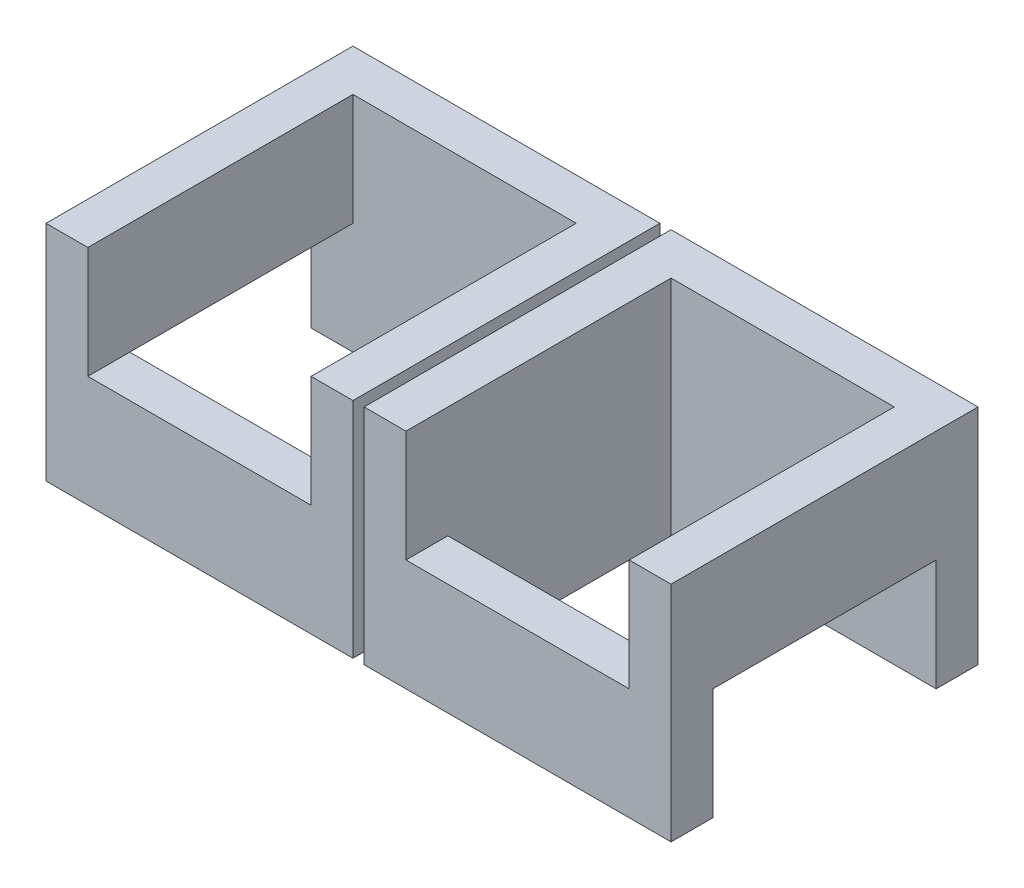
ISO-10303-21;
HEADER;
FILE_DESCRIPTION(('STEP AP214'),'2;1');
FILE_NAME('part.step','',(''),(''),'','','');
FILE_SCHEMA(('AUTOMOTIVE_DESIGN { 1 0 10303 214 1 1 1 1 }'));
ENDSEC;
DATA;
#1=APPLICATION_CONTEXT('core data for automotive mechanical design processes');
#2=APPLICATION_PROTOCOL_DEFINITION('international standard','automotive_design',2000,#1);
#3=PRODUCT_CONTEXT('',#1,'mechanical');
#4=PRODUCT('Part','Part','',(#3));
#5=PRODUCT_RELATED_PRODUCT_CATEGORY('part','',(#4));
#6=PRODUCT_DEFINITION_FORMATION('','',#4);
#7=PRODUCT_DEFINITION_CONTEXT('part definition',#1,'design');
#8=PRODUCT_DEFINITION('design','',#6,#7);
#9=PRODUCT_DEFINITION_SHAPE('','',#8);
#10=(LENGTH_UNIT() NAMED_UNIT(*) SI_UNIT(.MILLI.,.METRE.));
#11=(NAMED_UNIT(*) PLANE_ANGLE_UNIT() SI_UNIT($,.RADIAN.));
#12=(NAMED_UNIT(*) SI_UNIT($,.STERADIAN.) SOLID_ANGLE_UNIT());
#13=UNCERTAINTY_MEASURE_WITH_UNIT(LENGTH_MEASURE(1.E-05),#10,'distance_accuracy_value','');
#14=(GEOMETRIC_REPRESENTATION_CONTEXT(3) GLOBAL_UNCERTAINTY_ASSIGNED_CONTEXT((#13)) GLOBAL_UNIT_ASSIGNED_CONTEXT((#10,
#11,#12)) REPRESENTATION_CONTEXT('',''));
#15=CARTESIAN_POINT('',(0.,0.,0.));
#16=DIRECTION('',(0.,0.,1.));
#17=DIRECTION('',(1.,0.,0.));
#18=AXIS2_PLACEMENT_3D('',#15,#16,#17);
#19=CARTESIAN_POINT('',(195.58,101.6,50.8));
#20=DIRECTION('',(0.,0.,-1.));
#21=DIRECTION('',(1.,0.,0.));
#22=AXIS2_PLACEMENT_3D('',#19,#20,#21);
#23=PLANE('',#22);
#24=DIRECTION('',(-1.,0.,0.));
#25=VECTOR('',#24,1.);
#26=CARTESIAN_POINT('',(195.58,0.,50.8));
#27=LINE('',#26,#25);
#28=CARTESIAN_POINT('',(214.63,0.,50.8));
#29=VERTEX_POINT('',#28);
#30=CARTESIAN_POINT('',(93.98,0.,50.8));
#31=VERTEX_POINT('',#30);
#32=EDGE_CURVE('E222',#29,#31,#27,.T.);
#33=ORIENTED_EDGE('',*,*,#32,.T.);
#34=DIRECTION('',(0.,-1.,0.));
#35=VECTOR('',#34,1.);
#36=CARTESIAN_POINT('',(93.98,101.6,50.8));
#37=LINE('',#36,#35);
#38=CARTESIAN_POINT('',(93.98,50.8,50.8));
#39=VERTEX_POINT('',#38);
#40=EDGE_CURVE('E230',#39,#31,#37,.T.);
#41=ORIENTED_EDGE('',*,*,#40,.F.);
#42=DIRECTION('',(-1.,0.,0.));
#43=VECTOR('',#42,1.);
#44=CARTESIAN_POINT('',(195.58,50.8,50.8));
#45=LINE('',#44,#43);
#46=CARTESIAN_POINT('',(195.58,50.8,50.8));
#47=VERTEX_POINT('',#46);
#48=EDGE_CURVE('E188',#47,#39,#45,.T.);
#49=ORIENTED_EDGE('',*,*,#48,.F.);
#50=DIRECTION('',(1.,0.,0.));
#51=VECTOR('',#50,1.);
#52=CARTESIAN_POINT('',(195.58,50.8,50.8));
#53=LINE('',#52,#51);
#54=CARTESIAN_POINT('',(214.63,50.8,50.8));
#55=VERTEX_POINT('',#54);
#56=EDGE_CURVE('E169',#47,#55,#53,.T.);
#57=ORIENTED_EDGE('',*,*,#56,.T.);
#58=DIRECTION('',(0.,-1.,0.));
#59=VECTOR('',#58,1.);
#60=CARTESIAN_POINT('',(214.63,154.170510785233,50.8));
#61=LINE('',#60,#59);
#62=EDGE_CURVE('E177',#55,#29,#61,.T.);
#63=ORIENTED_EDGE('',*,*,#62,.T.);
#64=EDGE_LOOP('',(#33,#41,#49,#57,#63));
#65=FACE_BOUND('',#64,.T.);
#66=ADVANCED_FACE('F77',(#65),#23,.T.);
#67=CARTESIAN_POINT('',(144.78,101.6,0.));
#68=DIRECTION('',(0.,1.,0.));
#69=DIRECTION('',(0.,0.,1.));
#70=AXIS2_PLACEMENT_3D('',#67,#68,#69);
#71=PLANE('',#70);
#72=DIRECTION('',(-1.,0.,0.));
#73=VECTOR('',#72,1.);
#74=CARTESIAN_POINT('',(144.78,101.6,69.85));
#75=LINE('',#74,#73);
#76=CARTESIAN_POINT('',(214.63,101.6,69.85));
#77=VERTEX_POINT('',#76);
#78=CARTESIAN_POINT('',(195.58,101.6,69.85));
#79=VERTEX_POINT('',#78);
#80=EDGE_CURVE('E263',#77,#79,#75,.T.);
#81=ORIENTED_EDGE('',*,*,#80,.F.);
#82=DIRECTION('',(0.,0.,1.));
#83=VECTOR('',#82,1.);
#84=CARTESIAN_POINT('',(214.63,101.6,0.));
#85=LINE('',#84,#83);
#86=CARTESIAN_POINT('',(214.63,101.6,-69.85));
#87=VERTEX_POINT('',#86);
#88=EDGE_CURVE('E258',#87,#77,#85,.T.);
#89=ORIENTED_EDGE('',*,*,#88,.F.);
#90=DIRECTION('',(1.,0.,0.));
#91=VECTOR('',#90,1.);
#92=CARTESIAN_POINT('',(144.78,101.6,-69.85));
#93=LINE('',#92,#91);
#94=CARTESIAN_POINT('',(74.93,101.6,-69.85));
#95=VERTEX_POINT('',#94);
#96=EDGE_CURVE('E253',#95,#87,#93,.T.);
#97=ORIENTED_EDGE('',*,*,#96,.F.);
#98=DIRECTION('',(0.,0.,-1.));
#99=VECTOR('',#98,1.);
#100=CARTESIAN_POINT('',(74.93,101.6,0.));
#101=LINE('',#100,#99);
#102=CARTESIAN_POINT('',(74.93,101.6,69.85));
#103=VERTEX_POINT('',#102);
#104=EDGE_CURVE('E249',#103,#95,#101,.T.);
#105=ORIENTED_EDGE('',*,*,#104,.F.);
#106=CARTESIAN_POINT('',(93.98,101.6,69.85));
#107=VERTEX_POINT('',#106);
#108=EDGE_CURVE('E262',#107,#103,#75,.T.);
#109=ORIENTED_EDGE('',*,*,#108,.F.);
#110=DIRECTION('',(0.,0.,-1.));
#111=VECTOR('',#110,1.);
#112=CARTESIAN_POINT('',(93.98,101.6,50.8));
#113=LINE('',#112,#111);
#114=CARTESIAN_POINT('',(93.98,101.6,-50.8));
#115=VERTEX_POINT('',#114);
#116=EDGE_CURVE('E217',#107,#115,#113,.T.);
#117=ORIENTED_EDGE('',*,*,#116,.T.);
#118=DIRECTION('',(1.,0.,0.));
#119=VECTOR('',#118,1.);
#120=CARTESIAN_POINT('',(195.58,101.6,-50.8));
#121=LINE('',#120,#119);
#122=CARTESIAN_POINT('',(195.58,101.6,-50.8));
#123=VERTEX_POINT('',#122);
#124=EDGE_CURVE('E221',#115,#123,#121,.T.);
#125=ORIENTED_EDGE('',*,*,#124,.T.);
#126=DIRECTION('',(0.,0.,1.));
#127=VECTOR('',#126,1.);
#128=CARTESIAN_POINT('',(195.58,101.6,50.8));
#129=LINE('',#128,#127);
#130=EDGE_CURVE('E226',#123,#79,#129,.T.);
#131=ORIENTED_EDGE('',*,*,#130,.T.);
#132=EDGE_LOOP('',(#81,#89,#97,#105,#109,#117,#125,#131));
#133=FACE_BOUND('',#132,.T.);
#134=ADVANCED_FACE('F302',(#133),#71,.T.);
#135=CARTESIAN_POINT('',(144.78,0.,0.));
#136=DIRECTION('',(0.,1.,0.));
#137=DIRECTION('',(0.,0.,1.));
#138=AXIS2_PLACEMENT_3D('',#135,#136,#137);
#139=PLANE('',#138);
#140=DIRECTION('',(0.,0.,1.));
#141=VECTOR('',#140,1.);
#142=CARTESIAN_POINT('',(214.63,0.,0.));
#143=LINE('',#142,#141);
#144=CARTESIAN_POINT('',(214.63,0.,69.85));
#145=VERTEX_POINT('',#144);
#146=EDGE_CURVE('E182',#29,#145,#143,.T.);
#147=ORIENTED_EDGE('',*,*,#146,.T.);
#148=DIRECTION('',(-1.,0.,0.));
#149=VECTOR('',#148,1.);
#150=CARTESIAN_POINT('',(144.78,0.,69.85));
#151=LINE('',#150,#149);
#152=CARTESIAN_POINT('',(74.93,0.,69.85));
#153=VERTEX_POINT('',#152);
#154=EDGE_CURVE('E254',#145,#153,#151,.T.);
#155=ORIENTED_EDGE('',*,*,#154,.T.);
#156=DIRECTION('',(0.,0.,-1.));
#157=VECTOR('',#156,1.);
#158=CARTESIAN_POINT('',(74.93,0.,0.));
#159=LINE('',#158,#157);
#160=CARTESIAN_POINT('',(74.93,0.,-69.85));
#161=VERTEX_POINT('',#160);
#162=EDGE_CURVE('E248',#153,#161,#159,.T.);
#163=ORIENTED_EDGE('',*,*,#162,.T.);
#164=DIRECTION('',(1.,0.,0.));
#165=VECTOR('',#164,1.);
#166=CARTESIAN_POINT('',(144.78,0.,-69.85));
#167=LINE('',#166,#165);
#168=CARTESIAN_POINT('',(214.63,0.,-69.85));
#169=VERTEX_POINT('',#168);
#170=EDGE_CURVE('E271',#161,#169,#167,.T.);
#171=ORIENTED_EDGE('',*,*,#170,.T.);
#172=CARTESIAN_POINT('',(214.63,0.,-50.8));
#173=VERTEX_POINT('',#172);
#174=EDGE_CURVE('E275',#169,#173,#143,.T.);
#175=ORIENTED_EDGE('',*,*,#174,.T.);
#176=DIRECTION('',(1.,0.,0.));
#177=VECTOR('',#176,1.);
#178=CARTESIAN_POINT('',(195.58,0.,-50.8));
#179=LINE('',#178,#177);
#180=CARTESIAN_POINT('',(93.98,0.,-50.8));
#181=VERTEX_POINT('',#180);
#182=EDGE_CURVE('E233',#181,#173,#179,.T.);
#183=ORIENTED_EDGE('',*,*,#182,.F.);
#184=DIRECTION('',(0.,0.,-1.));
#185=VECTOR('',#184,1.);
#186=CARTESIAN_POINT('',(93.98,0.,50.8));
#187=LINE('',#186,#185);
#188=EDGE_CURVE('E101',#31,#181,#187,.T.);
#189=ORIENTED_EDGE('',*,*,#188,.F.);
#190=ORIENTED_EDGE('',*,*,#32,.F.);
#191=EDGE_LOOP('',(#147,#155,#163,#171,#175,#183,#189,#190));
#192=FACE_BOUND('',#191,.T.);
#193=ADVANCED_FACE('F293',(#192),#139,.F.);
#194=CARTESIAN_POINT('',(74.93,101.6,0.));
#195=DIRECTION('',(1.,0.,0.));
#196=DIRECTION('',(0.,0.,1.));
#197=AXIS2_PLACEMENT_3D('',#194,#195,#196);
#198=PLANE('',#197);
#199=ORIENTED_EDGE('',*,*,#162,.F.);
#200=DIRECTION('',(0.,-1.,0.));
#201=VECTOR('',#200,1.);
#202=CARTESIAN_POINT('',(74.93,101.6,69.85));
#203=LINE('',#202,#201);
#204=EDGE_CURVE('E267',#103,#153,#203,.T.);
#205=ORIENTED_EDGE('',*,*,#204,.F.);
#206=ORIENTED_EDGE('',*,*,#104,.T.);
#207=DIRECTION('',(0.,-1.,0.));
#208=VECTOR('',#207,1.);
#209=CARTESIAN_POINT('',(74.93,101.6,-69.85));
#210=LINE('',#209,#208);
#211=EDGE_CURVE('E13',#95,#161,#210,.T.);
#212=ORIENTED_EDGE('',*,*,#211,.T.);
#213=EDGE_LOOP('',(#199,#205,#206,#212));
#214=FACE_BOUND('',#213,.T.);
#215=ADVANCED_FACE('F79',(#214),#198,.F.);
#216=CARTESIAN_POINT('',(144.78,101.6,-69.85));
#217=DIRECTION('',(0.,0.,1.));
#218=DIRECTION('',(-1.,0.,0.));
#219=AXIS2_PLACEMENT_3D('',#216,#217,#218);
#220=PLANE('',#219);
#221=ORIENTED_EDGE('',*,*,#170,.F.);
#222=ORIENTED_EDGE('',*,*,#211,.F.);
#223=ORIENTED_EDGE('',*,*,#96,.T.);
#224=DIRECTION('',(0.,-1.,0.));
#225=VECTOR('',#224,1.);
#226=CARTESIAN_POINT('',(214.63,101.6,-69.85));
#227=LINE('',#226,#225);
#228=EDGE_CURVE('E86',#87,#169,#227,.T.);
#229=ORIENTED_EDGE('',*,*,#228,.T.);
#230=EDGE_LOOP('',(#221,#222,#223,#229));
#231=FACE_BOUND('',#230,.T.);
#232=ADVANCED_FACE('F290',(#231),#220,.F.);
#233=CARTESIAN_POINT('',(214.63,101.6,0.));
#234=DIRECTION('',(-1.,0.,0.));
#235=DIRECTION('',(0.,0.,-1.));
#236=AXIS2_PLACEMENT_3D('',#233,#234,#235);
#237=PLANE('',#236);
#238=DIRECTION('',(0.,0.,-1.));
#239=VECTOR('',#238,1.);
#240=CARTESIAN_POINT('',(214.63,50.8,50.8));
#241=LINE('',#240,#239);
#242=CARTESIAN_POINT('',(214.63,50.8,-50.8));
#243=VERTEX_POINT('',#242);
#244=EDGE_CURVE('E165',#55,#243,#241,.T.);
#245=ORIENTED_EDGE('',*,*,#244,.T.);
#246=DIRECTION('',(0.,-1.,0.));
#247=VECTOR('',#246,1.);
#248=CARTESIAN_POINT('',(214.63,154.170510785233,-50.8));
#249=LINE('',#248,#247);
#250=EDGE_CURVE('E176',#243,#173,#249,.T.);
#251=ORIENTED_EDGE('',*,*,#250,.T.);
#252=ORIENTED_EDGE('',*,*,#174,.F.);
#253=ORIENTED_EDGE('',*,*,#228,.F.);
#254=ORIENTED_EDGE('',*,*,#88,.T.);
#255=DIRECTION('',(0.,-1.,0.));
#256=VECTOR('',#255,1.);
#257=CARTESIAN_POINT('',(214.63,101.6,69.85));
#258=LINE('',#257,#256);
#259=EDGE_CURVE('E284',#77,#145,#258,.T.);
#260=ORIENTED_EDGE('',*,*,#259,.T.);
#261=ORIENTED_EDGE('',*,*,#146,.F.);
#262=ORIENTED_EDGE('',*,*,#62,.F.);
#263=EDGE_LOOP('',(#245,#251,#252,#253,#254,#260,#261,#262));
#264=FACE_BOUND('',#263,.T.);
#265=ADVANCED_FACE('F180',(#264),#237,.F.);
#266=CARTESIAN_POINT('',(144.78,101.6,69.85));
#267=DIRECTION('',(0.,0.,-1.));
#268=DIRECTION('',(1.,0.,0.));
#269=AXIS2_PLACEMENT_3D('',#266,#267,#268);
#270=PLANE('',#269);
#271=DIRECTION('',(1.,0.,0.));
#272=VECTOR('',#271,1.);
#273=CARTESIAN_POINT('',(195.58,50.8,69.85));
#274=LINE('',#273,#272);
#275=CARTESIAN_POINT('',(93.98,50.8,69.85));
#276=VERTEX_POINT('',#275);
#277=CARTESIAN_POINT('',(195.58,50.8,69.85));
#278=VERTEX_POINT('',#277);
#279=EDGE_CURVE('E209',#276,#278,#274,.T.);
#280=ORIENTED_EDGE('',*,*,#279,.F.);
#281=DIRECTION('',(0.,1.,0.));
#282=VECTOR('',#281,1.);
#283=CARTESIAN_POINT('',(93.98,-52.5705107852331,69.85));
#284=LINE('',#283,#282);
#285=EDGE_CURVE('E203',#276,#107,#284,.T.);
#286=ORIENTED_EDGE('',*,*,#285,.T.);
#287=ORIENTED_EDGE('',*,*,#108,.T.);
#288=ORIENTED_EDGE('',*,*,#204,.T.);
#289=ORIENTED_EDGE('',*,*,#154,.F.);
#290=ORIENTED_EDGE('',*,*,#259,.F.);
#291=ORIENTED_EDGE('',*,*,#80,.T.);
#292=DIRECTION('',(0.,1.,0.));
#293=VECTOR('',#292,1.);
#294=CARTESIAN_POINT('',(195.58,-52.5705107852331,69.85));
#295=LINE('',#294,#293);
#296=EDGE_CURVE('E196',#278,#79,#295,.T.);
#297=ORIENTED_EDGE('',*,*,#296,.F.);
#298=EDGE_LOOP('',(#280,#286,#287,#288,#289,#290,#291,#297));
#299=FACE_BOUND('',#298,.T.);
#300=ADVANCED_FACE('F305',(#299),#270,.F.);
#301=CARTESIAN_POINT('',(93.98,101.6,50.8));
#302=DIRECTION('',(1.,0.,0.));
#303=DIRECTION('',(0.,0.,1.));
#304=AXIS2_PLACEMENT_3D('',#301,#302,#303);
#305=PLANE('',#304);
#306=ORIENTED_EDGE('',*,*,#188,.T.);
#307=DIRECTION('',(0.,-1.,0.));
#308=VECTOR('',#307,1.);
#309=CARTESIAN_POINT('',(93.98,101.6,-50.8));
#310=LINE('',#309,#308);
#311=EDGE_CURVE('E245',#115,#181,#310,.T.);
#312=ORIENTED_EDGE('',*,*,#311,.F.);
#313=ORIENTED_EDGE('',*,*,#116,.F.);
#314=ORIENTED_EDGE('',*,*,#285,.F.);
#315=DIRECTION('',(0.,0.,1.));
#316=VECTOR('',#315,1.);
#317=CARTESIAN_POINT('',(93.98,50.8,50.8));
#318=LINE('',#317,#316);
#319=EDGE_CURVE('E93',#39,#276,#318,.T.);
#320=ORIENTED_EDGE('',*,*,#319,.F.);
#321=ORIENTED_EDGE('',*,*,#40,.T.);
#322=EDGE_LOOP('',(#306,#312,#313,#314,#320,#321));
#323=FACE_BOUND('',#322,.T.);
#324=ADVANCED_FACE('F310',(#323),#305,.T.);
#325=CARTESIAN_POINT('',(195.58,101.6,-50.8));
#326=DIRECTION('',(0.,0.,1.));
#327=DIRECTION('',(-1.,0.,0.));
#328=AXIS2_PLACEMENT_3D('',#325,#326,#327);
#329=PLANE('',#328);
#330=ORIENTED_EDGE('',*,*,#182,.T.);
#331=ORIENTED_EDGE('',*,*,#250,.F.);
#332=DIRECTION('',(-1.,0.,0.));
#333=VECTOR('',#332,1.);
#334=CARTESIAN_POINT('',(195.58,50.8,-50.8));
#335=LINE('',#334,#333);
#336=CARTESIAN_POINT('',(195.58,50.8,-50.8));
#337=VERTEX_POINT('',#336);
#338=EDGE_CURVE('E172',#243,#337,#335,.T.);
#339=ORIENTED_EDGE('',*,*,#338,.T.);
#340=DIRECTION('',(0.,-1.,0.));
#341=VECTOR('',#340,1.);
#342=CARTESIAN_POINT('',(195.58,101.6,-50.8));
#343=LINE('',#342,#341);
#344=EDGE_CURVE('E241',#123,#337,#343,.T.);
#345=ORIENTED_EDGE('',*,*,#344,.F.);
#346=ORIENTED_EDGE('',*,*,#124,.F.);
#347=ORIENTED_EDGE('',*,*,#311,.T.);
#348=EDGE_LOOP('',(#330,#331,#339,#345,#346,#347));
#349=FACE_BOUND('',#348,.T.);
#350=ADVANCED_FACE('F312',(#349),#329,.T.);
#351=CARTESIAN_POINT('',(195.58,101.6,50.8));
#352=DIRECTION('',(-1.,0.,0.));
#353=DIRECTION('',(0.,0.,-1.));
#354=AXIS2_PLACEMENT_3D('',#351,#352,#353);
#355=PLANE('',#354);
#356=DIRECTION('',(0.,0.,1.));
#357=VECTOR('',#356,1.);
#358=CARTESIAN_POINT('',(195.58,50.8,50.8));
#359=LINE('',#358,#357);
#360=EDGE_CURVE('E192',#337,#47,#359,.T.);
#361=ORIENTED_EDGE('',*,*,#360,.T.);
#362=DIRECTION('',(0.,0.,-1.));
#363=VECTOR('',#362,1.);
#364=CARTESIAN_POINT('',(195.58,50.8,50.8));
#365=LINE('',#364,#363);
#366=EDGE_CURVE('E206',#278,#47,#365,.T.);
#367=ORIENTED_EDGE('',*,*,#366,.F.);
#368=ORIENTED_EDGE('',*,*,#296,.T.);
#369=ORIENTED_EDGE('',*,*,#130,.F.);
#370=ORIENTED_EDGE('',*,*,#344,.T.);
#371=EDGE_LOOP('',(#361,#367,#368,#369,#370));
#372=FACE_BOUND('',#371,.T.);
#373=ADVANCED_FACE('F315',(#372),#355,.T.);
#374=CARTESIAN_POINT('',(144.78,50.8,0.));
#375=DIRECTION('',(0.,1.,0.));
#376=DIRECTION('',(0.,0.,1.));
#377=AXIS2_PLACEMENT_3D('',#374,#375,#376);
#378=PLANE('',#377);
#379=ORIENTED_EDGE('',*,*,#366,.T.);
#380=ORIENTED_EDGE('',*,*,#48,.T.);
#381=ORIENTED_EDGE('',*,*,#319,.T.);
#382=ORIENTED_EDGE('',*,*,#279,.T.);
#383=EDGE_LOOP('',(#379,#380,#381,#382));
#384=FACE_BOUND('',#383,.T.);
#385=ADVANCED_FACE('F318',(#384),#378,.T.);
#386=CARTESIAN_POINT('',(144.78,50.8,0.));
#387=DIRECTION('',(0.,1.,0.));
#388=DIRECTION('',(0.,0.,1.));
#389=AXIS2_PLACEMENT_3D('',#386,#387,#388);
#390=PLANE('',#389);
#391=ORIENTED_EDGE('',*,*,#360,.F.);
#392=ORIENTED_EDGE('',*,*,#338,.F.);
#393=ORIENTED_EDGE('',*,*,#244,.F.);
#394=ORIENTED_EDGE('',*,*,#56,.F.);
#395=EDGE_LOOP('',(#391,#392,#393,#394));
#396=FACE_BOUND('',#395,.T.);
#397=ADVANCED_FACE('F167',(#396),#390,.F.);
#398=CLOSED_SHELL('',(#66,#134,#193,#215,#232,#265,#300,#324,#350,#373,#385,#397));
#399=MANIFOLD_SOLID_BREP('B2',#398);
#400=CARTESIAN_POINT('',(-50.8,101.6,50.8));
#401=DIRECTION('',(0.,0.,-1.));
#402=DIRECTION('',(-1.,0.,0.));
#403=AXIS2_PLACEMENT_3D('',#400,#401,#402);
#404=PLANE('',#403);
#405=DIRECTION('',(1.,0.,0.));
#406=VECTOR('',#405,1.);
#407=CARTESIAN_POINT('',(-50.8,0.,50.8));
#408=LINE('',#407,#406);
#409=CARTESIAN_POINT('',(-69.85,0.,50.8));
#410=VERTEX_POINT('',#409);
#411=CARTESIAN_POINT('',(50.8,0.,50.8));
#412=VERTEX_POINT('',#411);
#413=EDGE_CURVE('E542',#410,#412,#408,.T.);
#414=ORIENTED_EDGE('',*,*,#413,.F.);
#415=DIRECTION('',(0.,-1.,0.));
#416=VECTOR('',#415,1.);
#417=CARTESIAN_POINT('',(-69.85,154.170510785233,50.8));
#418=LINE('',#417,#416);
#419=CARTESIAN_POINT('',(-69.85,50.8,50.8));
#420=VERTEX_POINT('',#419);
#421=EDGE_CURVE('E537',#420,#410,#418,.T.);
#422=ORIENTED_EDGE('',*,*,#421,.F.);
#423=DIRECTION('',(-1.,0.,0.));
#424=VECTOR('',#423,1.);
#425=CARTESIAN_POINT('',(-50.8,50.8,50.8));
#426=LINE('',#425,#424);
#427=CARTESIAN_POINT('',(-50.8,50.8,50.8));
#428=VERTEX_POINT('',#427);
#429=EDGE_CURVE('E539',#428,#420,#426,.T.);
#430=ORIENTED_EDGE('',*,*,#429,.F.);
#431=DIRECTION('',(1.,0.,0.));
#432=VECTOR('',#431,1.);
#433=CARTESIAN_POINT('',(-50.8,50.8,50.8));
#434=LINE('',#433,#432);
#435=CARTESIAN_POINT('',(50.8,50.8,50.8));
#436=VERTEX_POINT('',#435);
#437=EDGE_CURVE('E567',#428,#436,#434,.T.);
#438=ORIENTED_EDGE('',*,*,#437,.T.);
#439=DIRECTION('',(0.,-1.,0.));
#440=VECTOR('',#439,1.);
#441=CARTESIAN_POINT('',(50.8,101.6,50.8));
#442=LINE('',#441,#440);
#443=EDGE_CURVE('E474',#436,#412,#442,.T.);
#444=ORIENTED_EDGE('',*,*,#443,.T.);
#445=EDGE_LOOP('',(#414,#422,#430,#438,#444));
#446=FACE_BOUND('',#445,.T.);
#447=ADVANCED_FACE('F452',(#446),#404,.T.);
#448=CARTESIAN_POINT('',(0.,101.6,0.));
#449=DIRECTION('',(0.,1.,0.));
#450=DIRECTION('',(0.,0.,1.));
#451=AXIS2_PLACEMENT_3D('',#448,#449,#450);
#452=PLANE('',#451);
#453=DIRECTION('',(1.,0.,0.));
#454=VECTOR('',#453,1.);
#455=CARTESIAN_POINT('',(0.,101.6,69.85));
#456=LINE('',#455,#454);
#457=CARTESIAN_POINT('',(-69.85,101.6,69.85));
#458=VERTEX_POINT('',#457);
#459=CARTESIAN_POINT('',(-50.8,101.6,69.85));
#460=VERTEX_POINT('',#459);
#461=EDGE_CURVE('E609',#458,#460,#456,.T.);
#462=ORIENTED_EDGE('',*,*,#461,.T.);
#463=DIRECTION('',(0.,0.,1.));
#464=VECTOR('',#463,1.);
#465=CARTESIAN_POINT('',(-50.8,101.6,50.8));
#466=LINE('',#465,#464);
#467=CARTESIAN_POINT('',(-50.8,101.6,-50.8));
#468=VERTEX_POINT('',#467);
#469=EDGE_CURVE('E585',#468,#460,#466,.T.);
#470=ORIENTED_EDGE('',*,*,#469,.F.);
#471=DIRECTION('',(-1.,0.,0.));
#472=VECTOR('',#471,1.);
#473=CARTESIAN_POINT('',(-50.8,101.6,-50.8));
#474=LINE('',#473,#472);
#475=CARTESIAN_POINT('',(50.8,101.6,-50.8));
#476=VERTEX_POINT('',#475);
#477=EDGE_CURVE('E583',#476,#468,#474,.T.);
#478=ORIENTED_EDGE('',*,*,#477,.F.);
#479=DIRECTION('',(0.,0.,-1.));
#480=VECTOR('',#479,1.);
#481=CARTESIAN_POINT('',(50.8,101.6,50.8));
#482=LINE('',#481,#480);
#483=CARTESIAN_POINT('',(50.8,101.6,69.85));
#484=VERTEX_POINT('',#483);
#485=EDGE_CURVE('E581',#484,#476,#482,.T.);
#486=ORIENTED_EDGE('',*,*,#485,.F.);
#487=CARTESIAN_POINT('',(69.85,101.6,69.85));
#488=VERTEX_POINT('',#487);
#489=EDGE_CURVE('E608',#484,#488,#456,.T.);
#490=ORIENTED_EDGE('',*,*,#489,.T.);
#491=DIRECTION('',(0.,0.,-1.));
#492=VECTOR('',#491,1.);
#493=CARTESIAN_POINT('',(69.85,101.6,0.));
#494=LINE('',#493,#492);
#495=CARTESIAN_POINT('',(69.85,101.6,-69.85));
#496=VERTEX_POINT('',#495);
#497=EDGE_CURVE('E600',#488,#496,#494,.T.);
#498=ORIENTED_EDGE('',*,*,#497,.T.);
#499=DIRECTION('',(-1.,0.,0.));
#500=VECTOR('',#499,1.);
#501=CARTESIAN_POINT('',(0.,101.6,-69.85));
#502=LINE('',#501,#500);
#503=CARTESIAN_POINT('',(-69.85,101.6,-69.85));
#504=VERTEX_POINT('',#503);
#505=EDGE_CURVE('E603',#496,#504,#502,.T.);
#506=ORIENTED_EDGE('',*,*,#505,.T.);
#507=DIRECTION('',(0.,0.,1.));
#508=VECTOR('',#507,1.);
#509=CARTESIAN_POINT('',(-69.85,101.6,0.));
#510=LINE('',#509,#508);
#511=EDGE_CURVE('E606',#504,#458,#510,.T.);
#512=ORIENTED_EDGE('',*,*,#511,.T.);
#513=EDGE_LOOP('',(#462,#470,#478,#486,#490,#498,#506,#512));
#514=FACE_BOUND('',#513,.T.);
#515=ADVANCED_FACE('F651',(#514),#452,.T.);
#516=CARTESIAN_POINT('',(0.,0.,0.));
#517=DIRECTION('',(0.,1.,0.));
#518=DIRECTION('',(0.,0.,1.));
#519=AXIS2_PLACEMENT_3D('',#516,#517,#518);
#520=PLANE('',#519);
#521=DIRECTION('',(0.,0.,1.));
#522=VECTOR('',#521,1.);
#523=CARTESIAN_POINT('',(-69.85,0.,0.));
#524=LINE('',#523,#522);
#525=CARTESIAN_POINT('',(-69.85,0.,69.85));
#526=VERTEX_POINT('',#525);
#527=EDGE_CURVE('E617',#410,#526,#524,.T.);
#528=ORIENTED_EDGE('',*,*,#527,.F.);
#529=ORIENTED_EDGE('',*,*,#413,.T.);
#530=DIRECTION('',(0.,0.,-1.));
#531=VECTOR('',#530,1.);
#532=CARTESIAN_POINT('',(50.8,0.,50.8));
#533=LINE('',#532,#531);
#534=CARTESIAN_POINT('',(50.8,0.,-50.8));
#535=VERTEX_POINT('',#534);
#536=EDGE_CURVE('E580',#412,#535,#533,.T.);
#537=ORIENTED_EDGE('',*,*,#536,.T.);
#538=DIRECTION('',(-1.,0.,0.));
#539=VECTOR('',#538,1.);
#540=CARTESIAN_POINT('',(-50.8,0.,-50.8));
#541=LINE('',#540,#539);
#542=CARTESIAN_POINT('',(-69.85,0.,-50.8));
#543=VERTEX_POINT('',#542);
#544=EDGE_CURVE('E589',#535,#543,#541,.T.);
#545=ORIENTED_EDGE('',*,*,#544,.T.);
#546=CARTESIAN_POINT('',(-69.85,0.,-69.85));
#547=VERTEX_POINT('',#546);
#548=EDGE_CURVE('E618',#547,#543,#524,.T.);
#549=ORIENTED_EDGE('',*,*,#548,.F.);
#550=DIRECTION('',(-1.,0.,0.));
#551=VECTOR('',#550,1.);
#552=CARTESIAN_POINT('',(0.,0.,-69.85));
#553=LINE('',#552,#551);
#554=CARTESIAN_POINT('',(69.85,0.,-69.85));
#555=VERTEX_POINT('',#554);
#556=EDGE_CURVE('E615',#555,#547,#553,.T.);
#557=ORIENTED_EDGE('',*,*,#556,.F.);
#558=DIRECTION('',(0.,0.,-1.));
#559=VECTOR('',#558,1.);
#560=CARTESIAN_POINT('',(69.85,0.,0.));
#561=LINE('',#560,#559);
#562=CARTESIAN_POINT('',(69.85,0.,69.85));
#563=VERTEX_POINT('',#562);
#564=EDGE_CURVE('E599',#563,#555,#561,.T.);
#565=ORIENTED_EDGE('',*,*,#564,.F.);
#566=DIRECTION('',(1.,0.,0.));
#567=VECTOR('',#566,1.);
#568=CARTESIAN_POINT('',(0.,0.,69.85));
#569=LINE('',#568,#567);
#570=EDGE_CURVE('E604',#526,#563,#569,.T.);
#571=ORIENTED_EDGE('',*,*,#570,.F.);
#572=EDGE_LOOP('',(#528,#529,#537,#545,#549,#557,#565,#571));
#573=FACE_BOUND('',#572,.T.);
#574=ADVANCED_FACE('F632',(#573),#520,.F.);
#575=CARTESIAN_POINT('',(69.85,101.6,0.));
#576=DIRECTION('',(-1.,0.,0.));
#577=DIRECTION('',(0.,0.,1.));
#578=AXIS2_PLACEMENT_3D('',#575,#576,#577);
#579=PLANE('',#578);
#580=ORIENTED_EDGE('',*,*,#564,.T.);
#581=DIRECTION('',(0.,-1.,0.));
#582=VECTOR('',#581,1.);
#583=CARTESIAN_POINT('',(69.85,101.6,-69.85));
#584=LINE('',#583,#582);
#585=EDGE_CURVE('E75',#496,#555,#584,.T.);
#586=ORIENTED_EDGE('',*,*,#585,.F.);
#587=ORIENTED_EDGE('',*,*,#497,.F.);
#588=DIRECTION('',(0.,-1.,0.));
#589=VECTOR('',#588,1.);
#590=CARTESIAN_POINT('',(69.85,101.6,69.85));
#591=LINE('',#590,#589);
#592=EDGE_CURVE('E612',#488,#563,#591,.T.);
#593=ORIENTED_EDGE('',*,*,#592,.T.);
#594=EDGE_LOOP('',(#580,#586,#587,#593));
#595=FACE_BOUND('',#594,.T.);
#596=ADVANCED_FACE('F454',(#595),#579,.F.);
#597=CARTESIAN_POINT('',(0.,101.6,-69.85));
#598=DIRECTION('',(0.,0.,1.));
#599=DIRECTION('',(1.,0.,0.));
#600=AXIS2_PLACEMENT_3D('',#597,#598,#599);
#601=PLANE('',#600);
#602=ORIENTED_EDGE('',*,*,#556,.T.);
#603=DIRECTION('',(0.,-1.,0.));
#604=VECTOR('',#603,1.);
#605=CARTESIAN_POINT('',(-69.85,101.6,-69.85));
#606=LINE('',#605,#604);
#607=EDGE_CURVE('E460',#504,#547,#606,.T.);
#608=ORIENTED_EDGE('',*,*,#607,.F.);
#609=ORIENTED_EDGE('',*,*,#505,.F.);
#610=ORIENTED_EDGE('',*,*,#585,.T.);
#611=EDGE_LOOP('',(#602,#608,#609,#610));
#612=FACE_BOUND('',#611,.T.);
#613=ADVANCED_FACE('F655',(#612),#601,.F.);
#614=CARTESIAN_POINT('',(-69.85,101.6,0.));
#615=DIRECTION('',(1.,0.,0.));
#616=DIRECTION('',(0.,0.,-1.));
#617=AXIS2_PLACEMENT_3D('',#614,#615,#616);
#618=PLANE('',#617);
#619=DIRECTION('',(0.,0.,-1.));
#620=VECTOR('',#619,1.);
#621=CARTESIAN_POINT('',(-69.85,50.8,50.8));
#622=LINE('',#621,#620);
#623=CARTESIAN_POINT('',(-69.85,50.8,-50.8));
#624=VERTEX_POINT('',#623);
#625=EDGE_CURVE('E546',#420,#624,#622,.T.);
#626=ORIENTED_EDGE('',*,*,#625,.F.);
#627=ORIENTED_EDGE('',*,*,#421,.T.);
#628=ORIENTED_EDGE('',*,*,#527,.T.);
#629=DIRECTION('',(0.,-1.,0.));
#630=VECTOR('',#629,1.);
#631=CARTESIAN_POINT('',(-69.85,101.6,69.85));
#632=LINE('',#631,#630);
#633=EDGE_CURVE('E623',#458,#526,#632,.T.);
#634=ORIENTED_EDGE('',*,*,#633,.F.);
#635=ORIENTED_EDGE('',*,*,#511,.F.);
#636=ORIENTED_EDGE('',*,*,#607,.T.);
#637=ORIENTED_EDGE('',*,*,#548,.T.);
#638=DIRECTION('',(0.,-1.,0.));
#639=VECTOR('',#638,1.);
#640=CARTESIAN_POINT('',(-69.85,154.170510785233,-50.8));
#641=LINE('',#640,#639);
#642=EDGE_CURVE('E559',#624,#543,#641,.T.);
#643=ORIENTED_EDGE('',*,*,#642,.F.);
#644=EDGE_LOOP('',(#626,#627,#628,#634,#635,#636,#637,#643));
#645=FACE_BOUND('',#644,.T.);
#646=ADVANCED_FACE('F556',(#645),#618,.F.);
#647=CARTESIAN_POINT('',(0.,101.6,69.85));
#648=DIRECTION('',(0.,0.,-1.));
#649=DIRECTION('',(-1.,0.,0.));
#650=AXIS2_PLACEMENT_3D('',#647,#648,#649);
#651=PLANE('',#650);
#652=DIRECTION('',(-1.,0.,0.));
#653=VECTOR('',#652,1.);
#654=CARTESIAN_POINT('',(-50.8,50.8,69.85));
#655=LINE('',#654,#653);
#656=CARTESIAN_POINT('',(50.8,50.8,69.85));
#657=VERTEX_POINT('',#656);
#658=CARTESIAN_POINT('',(-50.8,50.8,69.85));
#659=VERTEX_POINT('',#658);
#660=EDGE_CURVE('E572',#657,#659,#655,.T.);
#661=ORIENTED_EDGE('',*,*,#660,.T.);
#662=DIRECTION('',(0.,1.,0.));
#663=VECTOR('',#662,1.);
#664=CARTESIAN_POINT('',(-50.8,-52.5705107852331,69.85));
#665=LINE('',#664,#663);
#666=EDGE_CURVE('E575',#659,#460,#665,.T.);
#667=ORIENTED_EDGE('',*,*,#666,.T.);
#668=ORIENTED_EDGE('',*,*,#461,.F.);
#669=ORIENTED_EDGE('',*,*,#633,.T.);
#670=ORIENTED_EDGE('',*,*,#570,.T.);
#671=ORIENTED_EDGE('',*,*,#592,.F.);
#672=ORIENTED_EDGE('',*,*,#489,.F.);
#673=DIRECTION('',(0.,1.,0.));
#674=VECTOR('',#673,1.);
#675=CARTESIAN_POINT('',(50.8,-52.5705107852331,69.85));
#676=LINE('',#675,#674);
#677=EDGE_CURVE('E568',#657,#484,#676,.T.);
#678=ORIENTED_EDGE('',*,*,#677,.F.);
#679=EDGE_LOOP('',(#661,#667,#668,#669,#670,#671,#672,#678));
#680=FACE_BOUND('',#679,.T.);
#681=ADVANCED_FACE('F648',(#680),#651,.F.);
#682=CARTESIAN_POINT('',(50.8,101.6,50.8));
#683=DIRECTION('',(-1.,0.,0.));
#684=DIRECTION('',(0.,0.,1.));
#685=AXIS2_PLACEMENT_3D('',#682,#683,#684);
#686=PLANE('',#685);
#687=ORIENTED_EDGE('',*,*,#536,.F.);
#688=ORIENTED_EDGE('',*,*,#443,.F.);
#689=DIRECTION('',(0.,0.,1.));
#690=VECTOR('',#689,1.);
#691=CARTESIAN_POINT('',(50.8,50.8,50.8));
#692=LINE('',#691,#690);
#693=EDGE_CURVE('E467',#436,#657,#692,.T.);
#694=ORIENTED_EDGE('',*,*,#693,.T.);
#695=ORIENTED_EDGE('',*,*,#677,.T.);
#696=ORIENTED_EDGE('',*,*,#485,.T.);
#697=DIRECTION('',(0.,-1.,0.));
#698=VECTOR('',#697,1.);
#699=CARTESIAN_POINT('',(50.8,101.6,-50.8));
#700=LINE('',#699,#698);
#701=EDGE_CURVE('E596',#476,#535,#700,.T.);
#702=ORIENTED_EDGE('',*,*,#701,.T.);
#703=EDGE_LOOP('',(#687,#688,#694,#695,#696,#702));
#704=FACE_BOUND('',#703,.T.);
#705=ADVANCED_FACE('F644',(#704),#686,.T.);
#706=CARTESIAN_POINT('',(-50.8,101.6,-50.8));
#707=DIRECTION('',(0.,0.,1.));
#708=DIRECTION('',(1.,0.,0.));
#709=AXIS2_PLACEMENT_3D('',#706,#707,#708);
#710=PLANE('',#709);
#711=ORIENTED_EDGE('',*,*,#544,.F.);
#712=ORIENTED_EDGE('',*,*,#701,.F.);
#713=ORIENTED_EDGE('',*,*,#477,.T.);
#714=DIRECTION('',(0.,-1.,0.));
#715=VECTOR('',#714,1.);
#716=CARTESIAN_POINT('',(-50.8,101.6,-50.8));
#717=LINE('',#716,#715);
#718=CARTESIAN_POINT('',(-50.8,50.8,-50.8));
#719=VERTEX_POINT('',#718);
#720=EDGE_CURVE('E593',#468,#719,#717,.T.);
#721=ORIENTED_EDGE('',*,*,#720,.T.);
#722=DIRECTION('',(1.,0.,0.));
#723=VECTOR('',#722,1.);
#724=CARTESIAN_POINT('',(-50.8,50.8,-50.8));
#725=LINE('',#724,#723);
#726=EDGE_CURVE('E561',#624,#719,#725,.T.);
#727=ORIENTED_EDGE('',*,*,#726,.F.);
#728=ORIENTED_EDGE('',*,*,#642,.T.);
#729=EDGE_LOOP('',(#711,#712,#713,#721,#727,#728));
#730=FACE_BOUND('',#729,.T.);
#731=ADVANCED_FACE('F636',(#730),#710,.T.);
#732=CARTESIAN_POINT('',(-50.8,101.6,50.8));
#733=DIRECTION('',(1.,0.,0.));
#734=DIRECTION('',(0.,0.,-1.));
#735=AXIS2_PLACEMENT_3D('',#732,#733,#734);
#736=PLANE('',#735);
#737=DIRECTION('',(0.,0.,1.));
#738=VECTOR('',#737,1.);
#739=CARTESIAN_POINT('',(-50.8,50.8,50.8));
#740=LINE('',#739,#738);
#741=EDGE_CURVE('E553',#719,#428,#740,.T.);
#742=ORIENTED_EDGE('',*,*,#741,.F.);
#743=ORIENTED_EDGE('',*,*,#720,.F.);
#744=ORIENTED_EDGE('',*,*,#469,.T.);
#745=ORIENTED_EDGE('',*,*,#666,.F.);
#746=DIRECTION('',(0.,0.,-1.));
#747=VECTOR('',#746,1.);
#748=CARTESIAN_POINT('',(-50.8,50.8,50.8));
#749=LINE('',#748,#747);
#750=EDGE_CURVE('E570',#659,#428,#749,.T.);
#751=ORIENTED_EDGE('',*,*,#750,.T.);
#752=EDGE_LOOP('',(#742,#743,#744,#745,#751));
#753=FACE_BOUND('',#752,.T.);
#754=ADVANCED_FACE('F639',(#753),#736,.T.);
#755=CARTESIAN_POINT('',(0.,50.8,0.));
#756=DIRECTION('',(0.,1.,0.));
#757=DIRECTION('',(0.,0.,1.));
#758=AXIS2_PLACEMENT_3D('',#755,#756,#757);
#759=PLANE('',#758);
#760=ORIENTED_EDGE('',*,*,#750,.F.);
#761=ORIENTED_EDGE('',*,*,#660,.F.);
#762=ORIENTED_EDGE('',*,*,#693,.F.);
#763=ORIENTED_EDGE('',*,*,#437,.F.);
#764=EDGE_LOOP('',(#760,#761,#762,#763));
#765=FACE_BOUND('',#764,.T.);
#766=ADVANCED_FACE('F642',(#765),#759,.T.);
#767=CARTESIAN_POINT('',(0.,50.8,0.));
#768=DIRECTION('',(0.,1.,0.));
#769=DIRECTION('',(0.,0.,1.));
#770=AXIS2_PLACEMENT_3D('',#767,#768,#769);
#771=PLANE('',#770);
#772=ORIENTED_EDGE('',*,*,#741,.T.);
#773=ORIENTED_EDGE('',*,*,#429,.T.);
#774=ORIENTED_EDGE('',*,*,#625,.T.);
#775=ORIENTED_EDGE('',*,*,#726,.T.);
#776=EDGE_LOOP('',(#772,#773,#774,#775));
#777=FACE_BOUND('',#776,.T.);
#778=ADVANCED_FACE('F550',(#777),#771,.F.);
#779=CLOSED_SHELL('',(#447,#515,#574,#596,#613,#646,#681,#705,#731,#754,#766,#778));
#780=MANIFOLD_SOLID_BREP('B7',#779);
#781=ADVANCED_BREP_SHAPE_REPRESENTATION('',(#18,#399,#780),#14);
#782=SHAPE_DEFINITION_REPRESENTATION(#9,#781);
ENDSEC;
END-ISO-10303-21;
